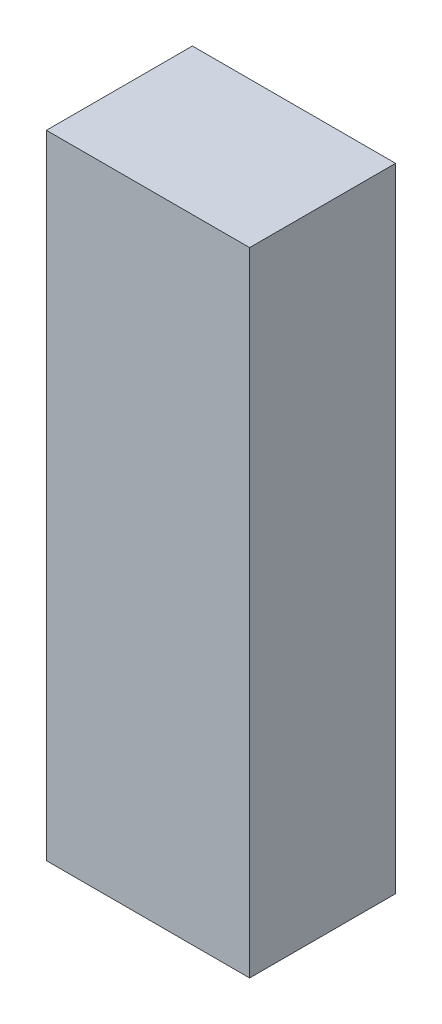
ISO-10303-21;
HEADER;
FILE_DESCRIPTION(('STEP AP214'),'2;1');
FILE_NAME('part.step','',(''),(''),'','','');
FILE_SCHEMA(('AUTOMOTIVE_DESIGN { 1 0 10303 214 1 1 1 1 }'));
ENDSEC;
DATA;
#1=APPLICATION_CONTEXT('core data for automotive mechanical design processes');
#2=APPLICATION_PROTOCOL_DEFINITION('international standard','automotive_design',2000,#1);
#3=PRODUCT_CONTEXT('',#1,'mechanical');
#4=PRODUCT('Part','Part','',(#3));
#5=PRODUCT_RELATED_PRODUCT_CATEGORY('part','',(#4));
#6=PRODUCT_DEFINITION_FORMATION('','',#4);
#7=PRODUCT_DEFINITION_CONTEXT('part definition',#1,'design');
#8=PRODUCT_DEFINITION('design','',#6,#7);
#9=PRODUCT_DEFINITION_SHAPE('','',#8);
#10=(LENGTH_UNIT() NAMED_UNIT(*) SI_UNIT(.MILLI.,.METRE.));
#11=(NAMED_UNIT(*) PLANE_ANGLE_UNIT() SI_UNIT($,.RADIAN.));
#12=(NAMED_UNIT(*) SI_UNIT($,.STERADIAN.) SOLID_ANGLE_UNIT());
#13=UNCERTAINTY_MEASURE_WITH_UNIT(LENGTH_MEASURE(1.E-05),#10,'distance_accuracy_value','');
#14=(GEOMETRIC_REPRESENTATION_CONTEXT(3) GLOBAL_UNCERTAINTY_ASSIGNED_CONTEXT((#13)) GLOBAL_UNIT_ASSIGNED_CONTEXT((#10,
#11,#12)) REPRESENTATION_CONTEXT('',''));
#15=CARTESIAN_POINT('',(0.,0.,0.));
#16=DIRECTION('',(0.,0.,1.));
#17=DIRECTION('',(1.,0.,0.));
#18=AXIS2_PLACEMENT_3D('',#15,#16,#17);
#19=CARTESIAN_POINT('',(-2.43713432164313,22.9784572552451,25.5));
#20=DIRECTION('',(1.,0.,0.));
#21=DIRECTION('',(0.,0.,-1.));
#22=AXIS2_PLACEMENT_3D('',#19,#20,#21);
#23=PLANE('',#22);
#24=DIRECTION('',(0.,-1.,0.));
#25=VECTOR('',#24,1.);
#26=CARTESIAN_POINT('',(-2.43713432164313,22.9784572552451,0.));
#27=LINE('',#26,#25);
#28=CARTESIAN_POINT('',(-2.43713432164313,133.478457255245,0.));
#29=VERTEX_POINT('',#28);
#30=CARTESIAN_POINT('',(-2.43713432164313,22.9784572552451,0.));
#31=VERTEX_POINT('',#30);
#32=EDGE_CURVE('E97',#29,#31,#27,.T.);
#33=ORIENTED_EDGE('',*,*,#32,.T.);
#34=DIRECTION('',(0.,0.,-1.));
#35=VECTOR('',#34,1.);
#36=CARTESIAN_POINT('',(-2.43713432164313,22.9784572552451,25.5));
#37=LINE('',#36,#35);
#38=CARTESIAN_POINT('',(-2.43713432164313,22.9784572552451,25.5));
#39=VERTEX_POINT('',#38);
#40=EDGE_CURVE('E11',#39,#31,#37,.T.);
#41=ORIENTED_EDGE('',*,*,#40,.F.);
#42=DIRECTION('',(0.,-1.,0.));
#43=VECTOR('',#42,1.);
#44=CARTESIAN_POINT('',(-2.43713432164313,22.9784572552451,25.5));
#45=LINE('',#44,#43);
#46=CARTESIAN_POINT('',(-2.43713432164313,133.478457255245,25.5));
#47=VERTEX_POINT('',#46);
#48=EDGE_CURVE('E85',#47,#39,#45,.T.);
#49=ORIENTED_EDGE('',*,*,#48,.F.);
#50=DIRECTION('',(0.,0.,-1.));
#51=VECTOR('',#50,1.);
#52=CARTESIAN_POINT('',(-2.43713432164313,133.478457255245,25.5));
#53=LINE('',#52,#51);
#54=EDGE_CURVE('E93',#47,#29,#53,.T.);
#55=ORIENTED_EDGE('',*,*,#54,.T.);
#56=EDGE_LOOP('',(#33,#41,#49,#55));
#57=FACE_BOUND('',#56,.T.);
#58=ADVANCED_FACE('F34',(#57),#23,.F.);
#59=CARTESIAN_POINT('',(33.0628656783569,22.9784572552451,25.5));
#60=DIRECTION('',(0.,1.,0.));
#61=DIRECTION('',(-1.,0.,0.));
#62=AXIS2_PLACEMENT_3D('',#59,#60,#61);
#63=PLANE('',#62);
#64=DIRECTION('',(1.,0.,0.));
#65=VECTOR('',#64,1.);
#66=CARTESIAN_POINT('',(33.0628656783569,22.9784572552451,0.));
#67=LINE('',#66,#65);
#68=CARTESIAN_POINT('',(33.0628656783569,22.9784572552451,0.));
#69=VERTEX_POINT('',#68);
#70=EDGE_CURVE('E89',#31,#69,#67,.T.);
#71=ORIENTED_EDGE('',*,*,#70,.T.);
#72=DIRECTION('',(0.,0.,-1.));
#73=VECTOR('',#72,1.);
#74=CARTESIAN_POINT('',(33.0628656783569,22.9784572552451,25.5));
#75=LINE('',#74,#73);
#76=CARTESIAN_POINT('',(33.0628656783569,22.9784572552451,25.5));
#77=VERTEX_POINT('',#76);
#78=EDGE_CURVE('E42',#77,#69,#75,.T.);
#79=ORIENTED_EDGE('',*,*,#78,.F.);
#80=DIRECTION('',(1.,0.,0.));
#81=VECTOR('',#80,1.);
#82=CARTESIAN_POINT('',(33.0628656783569,22.9784572552451,25.5));
#83=LINE('',#82,#81);
#84=EDGE_CURVE('E80',#39,#77,#83,.T.);
#85=ORIENTED_EDGE('',*,*,#84,.F.);
#86=ORIENTED_EDGE('',*,*,#40,.T.);
#87=EDGE_LOOP('',(#71,#79,#85,#86));
#88=FACE_BOUND('',#87,.T.);
#89=ADVANCED_FACE('F88',(#88),#63,.F.);
#90=CARTESIAN_POINT('',(33.0628656783569,22.9784572552451,25.5));
#91=DIRECTION('',(-1.,0.,0.));
#92=DIRECTION('',(0.,0.,1.));
#93=AXIS2_PLACEMENT_3D('',#90,#91,#92);
#94=PLANE('',#93);
#95=DIRECTION('',(0.,1.,0.));
#96=VECTOR('',#95,1.);
#97=CARTESIAN_POINT('',(33.0628656783569,22.9784572552451,0.));
#98=LINE('',#97,#96);
#99=CARTESIAN_POINT('',(33.0628656783569,133.478457255245,0.));
#100=VERTEX_POINT('',#99);
#101=EDGE_CURVE('E67',#69,#100,#98,.T.);
#102=ORIENTED_EDGE('',*,*,#101,.T.);
#103=DIRECTION('',(0.,0.,-1.));
#104=VECTOR('',#103,1.);
#105=CARTESIAN_POINT('',(33.0628656783569,133.478457255245,25.5));
#106=LINE('',#105,#104);
#107=CARTESIAN_POINT('',(33.0628656783569,133.478457255245,25.5));
#108=VERTEX_POINT('',#107);
#109=EDGE_CURVE('E90',#108,#100,#106,.T.);
#110=ORIENTED_EDGE('',*,*,#109,.F.);
#111=DIRECTION('',(0.,1.,0.));
#112=VECTOR('',#111,1.);
#113=CARTESIAN_POINT('',(33.0628656783569,22.9784572552451,25.5));
#114=LINE('',#113,#112);
#115=EDGE_CURVE('E83',#77,#108,#114,.T.);
#116=ORIENTED_EDGE('',*,*,#115,.F.);
#117=ORIENTED_EDGE('',*,*,#78,.T.);
#118=EDGE_LOOP('',(#102,#110,#116,#117));
#119=FACE_BOUND('',#118,.T.);
#120=ADVANCED_FACE('F91',(#119),#94,.F.);
#121=CARTESIAN_POINT('',(33.0628656783569,133.478457255245,25.5));
#122=DIRECTION('',(0.,-1.,0.));
#123=DIRECTION('',(0.,0.,-1.));
#124=AXIS2_PLACEMENT_3D('',#121,#122,#123);
#125=PLANE('',#124);
#126=DIRECTION('',(-1.,0.,0.));
#127=VECTOR('',#126,1.);
#128=CARTESIAN_POINT('',(33.0628656783569,133.478457255245,0.));
#129=LINE('',#128,#127);
#130=EDGE_CURVE('E73',#100,#29,#129,.T.);
#131=ORIENTED_EDGE('',*,*,#130,.T.);
#132=ORIENTED_EDGE('',*,*,#54,.F.);
#133=DIRECTION('',(-1.,0.,0.));
#134=VECTOR('',#133,1.);
#135=CARTESIAN_POINT('',(33.0628656783569,133.478457255245,25.5));
#136=LINE('',#135,#134);
#137=EDGE_CURVE('E50',#108,#47,#136,.T.);
#138=ORIENTED_EDGE('',*,*,#137,.F.);
#139=ORIENTED_EDGE('',*,*,#109,.T.);
#140=EDGE_LOOP('',(#131,#132,#138,#139));
#141=FACE_BOUND('',#140,.T.);
#142=ADVANCED_FACE('F104',(#141),#125,.F.);
#143=CARTESIAN_POINT('',(0.,0.,25.5));
#144=DIRECTION('',(0.,0.,1.));
#145=DIRECTION('',(1.,0.,0.));
#146=AXIS2_PLACEMENT_3D('',#143,#144,#145);
#147=PLANE('',#146);
#148=ORIENTED_EDGE('',*,*,#48,.T.);
#149=ORIENTED_EDGE('',*,*,#84,.T.);
#150=ORIENTED_EDGE('',*,*,#115,.T.);
#151=ORIENTED_EDGE('',*,*,#137,.T.);
#152=EDGE_LOOP('',(#148,#149,#150,#151));
#153=FACE_BOUND('',#152,.T.);
#154=ADVANCED_FACE('F81',(#153),#147,.T.);
#155=CARTESIAN_POINT('',(0.,0.,0.));
#156=DIRECTION('',(0.,0.,1.));
#157=DIRECTION('',(1.,0.,0.));
#158=AXIS2_PLACEMENT_3D('',#155,#156,#157);
#159=PLANE('',#158);
#160=ORIENTED_EDGE('',*,*,#32,.F.);
#161=ORIENTED_EDGE('',*,*,#130,.F.);
#162=ORIENTED_EDGE('',*,*,#101,.F.);
#163=ORIENTED_EDGE('',*,*,#70,.F.);
#164=EDGE_LOOP('',(#160,#161,#162,#163));
#165=FACE_BOUND('',#164,.T.);
#166=ADVANCED_FACE('F107',(#165),#159,.F.);
#167=CLOSED_SHELL('',(#58,#89,#120,#142,#154,#166));
#168=MANIFOLD_SOLID_BREP('B2',#167);
#169=ADVANCED_BREP_SHAPE_REPRESENTATION('',(#18,#168),#14);
#170=SHAPE_DEFINITION_REPRESENTATION(#9,#169);
ENDSEC;
END-ISO-10303-21;
